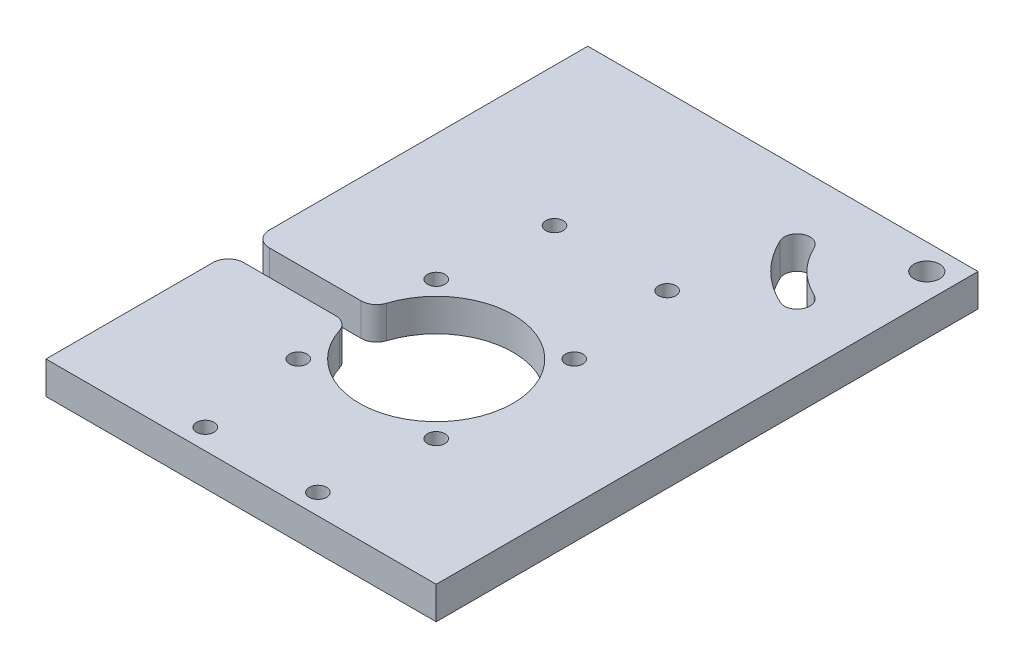
ISO-10303-21;
HEADER;
FILE_DESCRIPTION(('STEP AP214'),'2;1');
FILE_NAME('part.step','',(''),(''),'','','');
FILE_SCHEMA(('AUTOMOTIVE_DESIGN { 1 0 10303 214 1 1 1 1 }'));
ENDSEC;
DATA;
#1=APPLICATION_CONTEXT('core data for automotive mechanical design processes');
#2=APPLICATION_PROTOCOL_DEFINITION('international standard','automotive_design',2000,#1);
#3=PRODUCT_CONTEXT('',#1,'mechanical');
#4=PRODUCT('Part','Part','',(#3));
#5=PRODUCT_RELATED_PRODUCT_CATEGORY('part','',(#4));
#6=PRODUCT_DEFINITION_FORMATION('','',#4);
#7=PRODUCT_DEFINITION_CONTEXT('part definition',#1,'design');
#8=PRODUCT_DEFINITION('design','',#6,#7);
#9=PRODUCT_DEFINITION_SHAPE('','',#8);
#10=(LENGTH_UNIT() NAMED_UNIT(*) SI_UNIT(.MILLI.,.METRE.));
#11=(NAMED_UNIT(*) PLANE_ANGLE_UNIT() SI_UNIT($,.RADIAN.));
#12=(NAMED_UNIT(*) SI_UNIT($,.STERADIAN.) SOLID_ANGLE_UNIT());
#13=UNCERTAINTY_MEASURE_WITH_UNIT(LENGTH_MEASURE(1.E-05),#10,'distance_accuracy_value','');
#14=(GEOMETRIC_REPRESENTATION_CONTEXT(3) GLOBAL_UNCERTAINTY_ASSIGNED_CONTEXT((#13)) GLOBAL_UNIT_ASSIGNED_CONTEXT((#10,
#11,#12)) REPRESENTATION_CONTEXT('',''));
#15=CARTESIAN_POINT('',(0.,0.,0.));
#16=DIRECTION('',(0.,0.,1.));
#17=DIRECTION('',(1.,0.,0.));
#18=AXIS2_PLACEMENT_3D('',#15,#16,#17);
#19=CARTESIAN_POINT('',(0.,6.35,0.));
#20=DIRECTION('',(0.,-1.,0.));
#21=DIRECTION('',(0.,0.,-1.));
#22=AXIS2_PLACEMENT_3D('',#19,#20,#21);
#23=PLANE('',#22);
#24=CARTESIAN_POINT('',(-11.,6.35,34.1));
#25=DIRECTION('',(0.,1.,0.));
#26=DIRECTION('',(0.,0.,1.));
#27=AXIS2_PLACEMENT_3D('',#24,#25,#26);
#28=CIRCLE('',#27,1.69999999999999);
#29=CARTESIAN_POINT('',(-11.,6.35,35.8));
#30=VERTEX_POINT('',#29);
#31=EDGE_CURVE('E667',#30,#30,#28,.T.);
#32=ORIENTED_EDGE('',*,*,#31,.F.);
#33=EDGE_LOOP('',(#32));
#34=FACE_BOUND('',#33,.T.);
#35=CARTESIAN_POINT('',(11.,6.35,34.1));
#36=DIRECTION('',(0.,1.,0.));
#37=DIRECTION('',(0.,0.,1.));
#38=AXIS2_PLACEMENT_3D('',#35,#36,#37);
#39=CIRCLE('',#38,1.69999999999999);
#40=CARTESIAN_POINT('',(11.,6.35,35.8));
#41=VERTEX_POINT('',#40);
#42=EDGE_CURVE('E661',#41,#41,#39,.T.);
#43=ORIENTED_EDGE('',*,*,#42,.F.);
#44=EDGE_LOOP('',(#43));
#45=FACE_BOUND('',#44,.T.);
#46=CARTESIAN_POINT('',(-11.,6.35,-34.1));
#47=DIRECTION('',(0.,1.,0.));
#48=DIRECTION('',(0.,0.,1.));
#49=AXIS2_PLACEMENT_3D('',#46,#47,#48);
#50=CIRCLE('',#49,1.69999999999999);
#51=CARTESIAN_POINT('',(-11.,6.35,-32.4));
#52=VERTEX_POINT('',#51);
#53=EDGE_CURVE('E655',#52,#52,#50,.T.);
#54=ORIENTED_EDGE('',*,*,#53,.F.);
#55=EDGE_LOOP('',(#54));
#56=FACE_BOUND('',#55,.T.);
#57=CARTESIAN_POINT('',(11.,6.35,-34.1));
#58=DIRECTION('',(0.,1.,0.));
#59=DIRECTION('',(0.,0.,1.));
#60=AXIS2_PLACEMENT_3D('',#57,#58,#59);
#61=CIRCLE('',#60,1.69999999999999);
#62=CARTESIAN_POINT('',(11.,6.35,-32.4));
#63=VERTEX_POINT('',#62);
#64=EDGE_CURVE('E649',#63,#63,#61,.T.);
#65=ORIENTED_EDGE('',*,*,#64,.F.);
#66=EDGE_LOOP('',(#65));
#67=FACE_BOUND('',#66,.T.);
#68=CARTESIAN_POINT('',(-13.4703841816038,6.35,-13.4703841816037));
#69=DIRECTION('',(0.,1.,0.));
#70=DIRECTION('',(0.,0.,1.));
#71=AXIS2_PLACEMENT_3D('',#68,#69,#70);
#72=CIRCLE('',#71,1.69999999999999);
#73=CARTESIAN_POINT('',(-13.4703841816038,6.35,-11.7703841816037));
#74=VERTEX_POINT('',#73);
#75=EDGE_CURVE('E622',#74,#74,#72,.T.);
#76=ORIENTED_EDGE('',*,*,#75,.F.);
#77=EDGE_LOOP('',(#76));
#78=FACE_BOUND('',#77,.T.);
#79=CARTESIAN_POINT('',(13.4703841816037,6.35,-13.4703841816038));
#80=DIRECTION('',(0.,1.,0.));
#81=DIRECTION('',(0.,0.,1.));
#82=AXIS2_PLACEMENT_3D('',#79,#80,#81);
#83=CIRCLE('',#82,1.69999999999999);
#84=CARTESIAN_POINT('',(13.4703841816037,6.35,-11.7703841816038));
#85=VERTEX_POINT('',#84);
#86=EDGE_CURVE('E632',#85,#85,#83,.T.);
#87=ORIENTED_EDGE('',*,*,#86,.F.);
#88=EDGE_LOOP('',(#87));
#89=FACE_BOUND('',#88,.T.);
#90=DIRECTION('',(-1.,0.,0.));
#91=VECTOR('',#90,1.);
#92=CARTESIAN_POINT('',(-14.790199457749,6.35,2.5));
#93=LINE('',#92,#91);
#94=CARTESIAN_POINT('',(-17.1391365010026,6.35,2.5));
#95=VERTEX_POINT('',#94);
#96=CARTESIAN_POINT('',(-35.1,6.35,2.5));
#97=VERTEX_POINT('',#96);
#98=EDGE_CURVE('E331',#95,#97,#93,.T.);
#99=ORIENTED_EDGE('',*,*,#98,.T.);
#100=CARTESIAN_POINT('',(-35.1,6.35,5.5));
#101=DIRECTION('',(0.,-1.,0.));
#102=DIRECTION('',(0.,0.,-1.));
#103=AXIS2_PLACEMENT_3D('',#100,#101,#102);
#104=CIRCLE('',#103,3.);
#105=CARTESIAN_POINT('',(-38.1,6.35,5.5));
#106=VERTEX_POINT('',#105);
#107=EDGE_CURVE('E299',#97,#106,#104,.F.);
#108=ORIENTED_EDGE('',*,*,#107,.T.);
#109=DIRECTION('',(0.,0.,1.));
#110=VECTOR('',#109,1.);
#111=CARTESIAN_POINT('',(-38.1,6.35,2.5));
#112=LINE('',#111,#110);
#113=CARTESIAN_POINT('',(-38.1,6.35,38.1));
#114=VERTEX_POINT('',#113);
#115=EDGE_CURVE('E333',#106,#114,#112,.T.);
#116=ORIENTED_EDGE('',*,*,#115,.T.);
#117=DIRECTION('',(1.,0.,0.));
#118=VECTOR('',#117,1.);
#119=CARTESIAN_POINT('',(-38.1,6.35,38.1));
#120=LINE('',#119,#118);
#121=CARTESIAN_POINT('',(38.1,6.35,38.1));
#122=VERTEX_POINT('',#121);
#123=EDGE_CURVE('E237',#114,#122,#120,.T.);
#124=ORIENTED_EDGE('',*,*,#123,.T.);
#125=DIRECTION('',(0.,0.,-1.));
#126=VECTOR('',#125,1.);
#127=CARTESIAN_POINT('',(38.1,6.35,-67.7));
#128=LINE('',#127,#126);
#129=CARTESIAN_POINT('',(38.1,6.35,-67.7));
#130=VERTEX_POINT('',#129);
#131=EDGE_CURVE('E233',#122,#130,#128,.T.);
#132=ORIENTED_EDGE('',*,*,#131,.T.);
#133=DIRECTION('',(-1.,0.,0.));
#134=VECTOR('',#133,1.);
#135=CARTESIAN_POINT('',(-38.1,6.35,-67.7));
#136=LINE('',#135,#134);
#137=CARTESIAN_POINT('',(-38.1,6.35,-67.7));
#138=VERTEX_POINT('',#137);
#139=EDGE_CURVE('E236',#130,#138,#136,.T.);
#140=ORIENTED_EDGE('',*,*,#139,.T.);
#141=DIRECTION('',(0.,0.,1.));
#142=VECTOR('',#141,1.);
#143=CARTESIAN_POINT('',(-38.1,6.35,-67.7));
#144=LINE('',#143,#142);
#145=CARTESIAN_POINT('',(-38.1,6.35,-5.50000000000001));
#146=VERTEX_POINT('',#145);
#147=EDGE_CURVE('E241',#138,#146,#144,.T.);
#148=ORIENTED_EDGE('',*,*,#147,.T.);
#149=CARTESIAN_POINT('',(-35.1,6.35,-5.5));
#150=DIRECTION('',(0.,-1.,0.));
#151=DIRECTION('',(0.,0.,-1.));
#152=AXIS2_PLACEMENT_3D('',#149,#150,#151);
#153=CIRCLE('',#152,3.);
#154=CARTESIAN_POINT('',(-35.1,6.35,-2.5));
#155=VERTEX_POINT('',#154);
#156=EDGE_CURVE('E63',#146,#155,#153,.F.);
#157=ORIENTED_EDGE('',*,*,#156,.T.);
#158=DIRECTION('',(1.,0.,0.));
#159=VECTOR('',#158,1.);
#160=CARTESIAN_POINT('',(-38.1,6.35,-2.5));
#161=LINE('',#160,#159);
#162=CARTESIAN_POINT('',(-17.1391365010026,6.35,-2.5));
#163=VERTEX_POINT('',#162);
#164=EDGE_CURVE('E243',#155,#163,#161,.T.);
#165=ORIENTED_EDGE('',*,*,#164,.T.);
#166=CARTESIAN_POINT('',(-17.1391365010026,6.35,-5.5));
#167=DIRECTION('',(0.,-1.,0.));
#168=DIRECTION('',(0.,0.,-1.));
#169=AXIS2_PLACEMENT_3D('',#166,#167,#168);
#170=CIRCLE('',#169,3.);
#171=CARTESIAN_POINT('',(-14.2826137508355,6.35,-4.58333333333333));
#172=VERTEX_POINT('',#171);
#173=EDGE_CURVE('E294',#163,#172,#170,.F.);
#174=ORIENTED_EDGE('',*,*,#173,.T.);
#175=CARTESIAN_POINT('',(0.,6.35,0.));
#176=DIRECTION('',(0.,-1.,0.));
#177=DIRECTION('',(0.,0.,-1.));
#178=AXIS2_PLACEMENT_3D('',#175,#176,#177);
#179=CIRCLE('',#178,15.);
#180=CARTESIAN_POINT('',(-14.2826137508355,6.35,4.58333333333333));
#181=VERTEX_POINT('',#180);
#182=EDGE_CURVE('E266',#172,#181,#179,.T.);
#183=ORIENTED_EDGE('',*,*,#182,.T.);
#184=CARTESIAN_POINT('',(-17.1391365010026,6.35,5.5));
#185=DIRECTION('',(0.,-1.,0.));
#186=DIRECTION('',(0.,0.,-1.));
#187=AXIS2_PLACEMENT_3D('',#184,#185,#186);
#188=CIRCLE('',#187,3.);
#189=EDGE_CURVE('E296',#181,#95,#188,.F.);
#190=ORIENTED_EDGE('',*,*,#189,.T.);
#191=EDGE_LOOP('',(#99,#108,#116,#124,#132,#140,#148,#157,#165,#174,#183,#190));
#192=FACE_BOUND('',#191,.T.);
#193=CARTESIAN_POINT('',(25.0491221138397,6.35,-45.4348366569518));
#194=DIRECTION('',(0.,1.,0.));
#195=DIRECTION('',(0.,0.,1.));
#196=AXIS2_PLACEMENT_3D('',#193,#194,#195);
#197=CIRCLE('',#196,2.5);
#198=CARTESIAN_POINT('',(23.992576459488,6.35,-43.1690671893602));
#199=VERTEX_POINT('',#198);
#200=CARTESIAN_POINT('',(26.1056677681915,6.35,-47.7006061245434));
#201=VERTEX_POINT('',#200);
#202=EDGE_CURVE('E161',#199,#201,#197,.T.);
#203=ORIENTED_EDGE('',*,*,#202,.F.);
#204=CARTESIAN_POINT('',(33.1,6.35,-62.7));
#205=DIRECTION('',(0.,1.,0.));
#206=DIRECTION('',(0.,0.,-1.));
#207=AXIS2_PLACEMENT_3D('',#204,#205,#206);
#208=CIRCLE('',#207,21.55);
#209=CARTESIAN_POINT('',(13.5690671893602,6.35,-53.5925764594879));
#210=VERTEX_POINT('',#209);
#211=EDGE_CURVE('E191',#210,#199,#208,.T.);
#212=ORIENTED_EDGE('',*,*,#211,.F.);
#213=CARTESIAN_POINT('',(15.8348366569518,6.35,-54.6491221138396));
#214=DIRECTION('',(0.,1.,0.));
#215=DIRECTION('',(0.,0.,1.));
#216=AXIS2_PLACEMENT_3D('',#213,#214,#215);
#217=CIRCLE('',#216,2.5);
#218=CARTESIAN_POINT('',(18.1006061245434,6.35,-55.7056677681914));
#219=VERTEX_POINT('',#218);
#220=EDGE_CURVE('E187',#219,#210,#217,.T.);
#221=ORIENTED_EDGE('',*,*,#220,.F.);
#222=CARTESIAN_POINT('',(33.1,6.35,-62.7));
#223=DIRECTION('',(0.,-1.,0.));
#224=DIRECTION('',(0.,0.,-1.));
#225=AXIS2_PLACEMENT_3D('',#222,#223,#224);
#226=CIRCLE('',#225,16.55);
#227=EDGE_CURVE('E172',#201,#219,#226,.T.);
#228=ORIENTED_EDGE('',*,*,#227,.F.);
#229=EDGE_LOOP('',(#203,#212,#221,#228));
#230=FACE_BOUND('',#229,.T.);
#231=CARTESIAN_POINT('',(33.1,6.35,-62.7));
#232=DIRECTION('',(0.,1.,0.));
#233=DIRECTION('',(0.,0.,1.));
#234=AXIS2_PLACEMENT_3D('',#231,#232,#233);
#235=CIRCLE('',#234,2.5);
#236=CARTESIAN_POINT('',(33.1,6.35,-60.2));
#237=VERTEX_POINT('',#236);
#238=EDGE_CURVE('E201',#237,#237,#235,.T.);
#239=ORIENTED_EDGE('',*,*,#238,.F.);
#240=EDGE_LOOP('',(#239));
#241=FACE_BOUND('',#240,.T.);
#242=CARTESIAN_POINT('',(-13.4703841816037,6.35,13.4703841816038));
#243=DIRECTION('',(0.,1.,0.));
#244=DIRECTION('',(0.,0.,1.));
#245=AXIS2_PLACEMENT_3D('',#242,#243,#244);
#246=CIRCLE('',#245,1.69999999999999);
#247=CARTESIAN_POINT('',(-13.4703841816037,6.35,15.1703841816037));
#248=VERTEX_POINT('',#247);
#249=EDGE_CURVE('E623',#248,#248,#246,.T.);
#250=ORIENTED_EDGE('',*,*,#249,.F.);
#251=EDGE_LOOP('',(#250));
#252=FACE_BOUND('',#251,.T.);
#253=CARTESIAN_POINT('',(13.4703841816039,6.35,13.4703841816036));
#254=DIRECTION('',(0.,1.,0.));
#255=DIRECTION('',(0.,0.,1.));
#256=AXIS2_PLACEMENT_3D('',#253,#254,#255);
#257=CIRCLE('',#256,1.69999999999999);
#258=CARTESIAN_POINT('',(13.4703841816039,6.35,15.1703841816036));
#259=VERTEX_POINT('',#258);
#260=EDGE_CURVE('E643',#259,#259,#257,.T.);
#261=ORIENTED_EDGE('',*,*,#260,.F.);
#262=EDGE_LOOP('',(#261));
#263=FACE_BOUND('',#262,.T.);
#264=ADVANCED_FACE('F41',(#34,#45,#56,#67,#78,#89,#192,#230,#241,#252,#263),#23,.F.);
#265=CARTESIAN_POINT('',(0.,0.,0.));
#266=DIRECTION('',(0.,-1.,0.));
#267=DIRECTION('',(0.,0.,-1.));
#268=AXIS2_PLACEMENT_3D('',#265,#266,#267);
#269=PLANE('',#268);
#270=CARTESIAN_POINT('',(-11.,0.,34.1));
#271=DIRECTION('',(0.,1.,0.));
#272=DIRECTION('',(0.,0.,1.));
#273=AXIS2_PLACEMENT_3D('',#270,#271,#272);
#274=CIRCLE('',#273,1.7);
#275=CARTESIAN_POINT('',(-11.,0.,35.8));
#276=VERTEX_POINT('',#275);
#277=EDGE_CURVE('E664',#276,#276,#274,.T.);
#278=ORIENTED_EDGE('',*,*,#277,.T.);
#279=EDGE_LOOP('',(#278));
#280=FACE_BOUND('',#279,.T.);
#281=CARTESIAN_POINT('',(11.,0.,34.1));
#282=DIRECTION('',(0.,1.,0.));
#283=DIRECTION('',(0.,0.,1.));
#284=AXIS2_PLACEMENT_3D('',#281,#282,#283);
#285=CIRCLE('',#284,1.7);
#286=CARTESIAN_POINT('',(11.,0.,35.8));
#287=VERTEX_POINT('',#286);
#288=EDGE_CURVE('E658',#287,#287,#285,.T.);
#289=ORIENTED_EDGE('',*,*,#288,.T.);
#290=EDGE_LOOP('',(#289));
#291=FACE_BOUND('',#290,.T.);
#292=CARTESIAN_POINT('',(-11.,0.,-34.1));
#293=DIRECTION('',(0.,1.,0.));
#294=DIRECTION('',(0.,0.,1.));
#295=AXIS2_PLACEMENT_3D('',#292,#293,#294);
#296=CIRCLE('',#295,1.7);
#297=CARTESIAN_POINT('',(-11.,0.,-32.4));
#298=VERTEX_POINT('',#297);
#299=EDGE_CURVE('E652',#298,#298,#296,.T.);
#300=ORIENTED_EDGE('',*,*,#299,.T.);
#301=EDGE_LOOP('',(#300));
#302=FACE_BOUND('',#301,.T.);
#303=CARTESIAN_POINT('',(11.,0.,-34.1));
#304=DIRECTION('',(0.,1.,0.));
#305=DIRECTION('',(0.,0.,1.));
#306=AXIS2_PLACEMENT_3D('',#303,#304,#305);
#307=CIRCLE('',#306,1.7);
#308=CARTESIAN_POINT('',(11.,0.,-32.4));
#309=VERTEX_POINT('',#308);
#310=EDGE_CURVE('E646',#309,#309,#307,.T.);
#311=ORIENTED_EDGE('',*,*,#310,.T.);
#312=EDGE_LOOP('',(#311));
#313=FACE_BOUND('',#312,.T.);
#314=CARTESIAN_POINT('',(13.4703841816039,0.,13.4703841816036));
#315=DIRECTION('',(0.,1.,0.));
#316=DIRECTION('',(0.,0.,1.));
#317=AXIS2_PLACEMENT_3D('',#314,#315,#316);
#318=CIRCLE('',#317,1.7);
#319=CARTESIAN_POINT('',(13.4703841816039,0.,15.1703841816036));
#320=VERTEX_POINT('',#319);
#321=EDGE_CURVE('E628',#320,#320,#318,.T.);
#322=ORIENTED_EDGE('',*,*,#321,.T.);
#323=EDGE_LOOP('',(#322));
#324=FACE_BOUND('',#323,.T.);
#325=CARTESIAN_POINT('',(33.1,0.,-62.7));
#326=DIRECTION('',(0.,1.,0.));
#327=DIRECTION('',(0.,0.,1.));
#328=AXIS2_PLACEMENT_3D('',#325,#326,#327);
#329=CIRCLE('',#328,2.5);
#330=CARTESIAN_POINT('',(33.1,0.,-60.2));
#331=VERTEX_POINT('',#330);
#332=EDGE_CURVE('E227',#331,#331,#329,.T.);
#333=ORIENTED_EDGE('',*,*,#332,.T.);
#334=EDGE_LOOP('',(#333));
#335=FACE_BOUND('',#334,.T.);
#336=DIRECTION('',(0.,0.,1.));
#337=VECTOR('',#336,1.);
#338=CARTESIAN_POINT('',(-38.1,0.,2.5));
#339=LINE('',#338,#337);
#340=CARTESIAN_POINT('',(-38.1,0.,5.5));
#341=VERTEX_POINT('',#340);
#342=CARTESIAN_POINT('',(-38.1,0.,38.1));
#343=VERTEX_POINT('',#342);
#344=EDGE_CURVE('E252',#341,#343,#339,.T.);
#345=ORIENTED_EDGE('',*,*,#344,.F.);
#346=CARTESIAN_POINT('',(-35.1,0.,5.5));
#347=DIRECTION('',(0.,-1.,0.));
#348=DIRECTION('',(0.,0.,-1.));
#349=AXIS2_PLACEMENT_3D('',#346,#347,#348);
#350=CIRCLE('',#349,3.);
#351=CARTESIAN_POINT('',(-35.1,0.,2.5));
#352=VERTEX_POINT('',#351);
#353=EDGE_CURVE('E287',#341,#352,#350,.T.);
#354=ORIENTED_EDGE('',*,*,#353,.T.);
#355=DIRECTION('',(-1.,0.,0.));
#356=VECTOR('',#355,1.);
#357=CARTESIAN_POINT('',(-14.790199457749,0.,2.5));
#358=LINE('',#357,#356);
#359=CARTESIAN_POINT('',(-17.1391365010026,0.,2.5));
#360=VERTEX_POINT('',#359);
#361=EDGE_CURVE('E249',#360,#352,#358,.T.);
#362=ORIENTED_EDGE('',*,*,#361,.F.);
#363=CARTESIAN_POINT('',(-17.1391365010026,0.,5.5));
#364=DIRECTION('',(0.,-1.,0.));
#365=DIRECTION('',(0.,0.,-1.));
#366=AXIS2_PLACEMENT_3D('',#363,#364,#365);
#367=CIRCLE('',#366,3.);
#368=CARTESIAN_POINT('',(-14.2826137508355,0.,4.58333333333333));
#369=VERTEX_POINT('',#368);
#370=EDGE_CURVE('E283',#360,#369,#367,.T.);
#371=ORIENTED_EDGE('',*,*,#370,.T.);
#372=CARTESIAN_POINT('',(0.,0.,0.));
#373=DIRECTION('',(0.,-1.,0.));
#374=DIRECTION('',(0.,0.,-1.));
#375=AXIS2_PLACEMENT_3D('',#372,#373,#374);
#376=CIRCLE('',#375,15.);
#377=CARTESIAN_POINT('',(-14.2826137508355,0.,-4.58333333333333));
#378=VERTEX_POINT('',#377);
#379=EDGE_CURVE('E181',#378,#369,#376,.T.);
#380=ORIENTED_EDGE('',*,*,#379,.F.);
#381=CARTESIAN_POINT('',(-17.1391365010026,0.,-5.5));
#382=DIRECTION('',(0.,-1.,0.));
#383=DIRECTION('',(0.,0.,-1.));
#384=AXIS2_PLACEMENT_3D('',#381,#382,#383);
#385=CIRCLE('',#384,3.);
#386=CARTESIAN_POINT('',(-17.1391365010026,0.,-2.5));
#387=VERTEX_POINT('',#386);
#388=EDGE_CURVE('E281',#378,#387,#385,.T.);
#389=ORIENTED_EDGE('',*,*,#388,.T.);
#390=DIRECTION('',(1.,0.,0.));
#391=VECTOR('',#390,1.);
#392=CARTESIAN_POINT('',(-38.1,0.,-2.5));
#393=LINE('',#392,#391);
#394=CARTESIAN_POINT('',(-35.1,0.,-2.5));
#395=VERTEX_POINT('',#394);
#396=EDGE_CURVE('E263',#395,#387,#393,.T.);
#397=ORIENTED_EDGE('',*,*,#396,.F.);
#398=CARTESIAN_POINT('',(-35.1,0.,-5.5));
#399=DIRECTION('',(0.,-1.,0.));
#400=DIRECTION('',(0.,0.,-1.));
#401=AXIS2_PLACEMENT_3D('',#398,#399,#400);
#402=CIRCLE('',#401,3.);
#403=CARTESIAN_POINT('',(-38.1,0.,-5.50000000000001));
#404=VERTEX_POINT('',#403);
#405=EDGE_CURVE('E285',#395,#404,#402,.T.);
#406=ORIENTED_EDGE('',*,*,#405,.T.);
#407=DIRECTION('',(0.,0.,1.));
#408=VECTOR('',#407,1.);
#409=CARTESIAN_POINT('',(-38.1,0.,-67.7));
#410=LINE('',#409,#408);
#411=CARTESIAN_POINT('',(-38.1,0.,-67.7));
#412=VERTEX_POINT('',#411);
#413=EDGE_CURVE('E260',#412,#404,#410,.T.);
#414=ORIENTED_EDGE('',*,*,#413,.F.);
#415=DIRECTION('',(-1.,0.,0.));
#416=VECTOR('',#415,1.);
#417=CARTESIAN_POINT('',(-38.1,0.,-67.7));
#418=LINE('',#417,#416);
#419=CARTESIAN_POINT('',(38.1,0.,-67.7));
#420=VERTEX_POINT('',#419);
#421=EDGE_CURVE('E258',#420,#412,#418,.T.);
#422=ORIENTED_EDGE('',*,*,#421,.F.);
#423=DIRECTION('',(0.,0.,-1.));
#424=VECTOR('',#423,1.);
#425=CARTESIAN_POINT('',(38.1,0.,-67.7));
#426=LINE('',#425,#424);
#427=CARTESIAN_POINT('',(38.1,0.,38.1));
#428=VERTEX_POINT('',#427);
#429=EDGE_CURVE('E256',#428,#420,#426,.T.);
#430=ORIENTED_EDGE('',*,*,#429,.F.);
#431=DIRECTION('',(1.,0.,0.));
#432=VECTOR('',#431,1.);
#433=CARTESIAN_POINT('',(-38.1,0.,38.1));
#434=LINE('',#433,#432);
#435=EDGE_CURVE('E254',#343,#428,#434,.T.);
#436=ORIENTED_EDGE('',*,*,#435,.F.);
#437=EDGE_LOOP('',(#345,#354,#362,#371,#380,#389,#397,#406,#414,#422,#430,#436));
#438=FACE_BOUND('',#437,.T.);
#439=CARTESIAN_POINT('',(33.1,0.,-62.7));
#440=DIRECTION('',(0.,1.,0.));
#441=DIRECTION('',(0.,0.,-1.));
#442=AXIS2_PLACEMENT_3D('',#439,#440,#441);
#443=CIRCLE('',#442,21.55);
#444=CARTESIAN_POINT('',(13.5690671893602,0.,-53.5925764594879));
#445=VERTEX_POINT('',#444);
#446=CARTESIAN_POINT('',(23.992576459488,0.,-43.1690671893602));
#447=VERTEX_POINT('',#446);
#448=EDGE_CURVE('E173',#445,#447,#443,.T.);
#449=ORIENTED_EDGE('',*,*,#448,.T.);
#450=CARTESIAN_POINT('',(25.0491221138397,0.,-45.4348366569518));
#451=DIRECTION('',(0.,1.,0.));
#452=DIRECTION('',(0.,0.,1.));
#453=AXIS2_PLACEMENT_3D('',#450,#451,#452);
#454=CIRCLE('',#453,2.5);
#455=CARTESIAN_POINT('',(26.1056677681915,0.,-47.7006061245434));
#456=VERTEX_POINT('',#455);
#457=EDGE_CURVE('E198',#447,#456,#454,.T.);
#458=ORIENTED_EDGE('',*,*,#457,.T.);
#459=CARTESIAN_POINT('',(33.1,0.,-62.7));
#460=DIRECTION('',(0.,-1.,0.));
#461=DIRECTION('',(0.,0.,-1.));
#462=AXIS2_PLACEMENT_3D('',#459,#460,#461);
#463=CIRCLE('',#462,16.55);
#464=CARTESIAN_POINT('',(18.1006061245434,0.,-55.7056677681914));
#465=VERTEX_POINT('',#464);
#466=EDGE_CURVE('E179',#456,#465,#463,.T.);
#467=ORIENTED_EDGE('',*,*,#466,.T.);
#468=CARTESIAN_POINT('',(15.8348366569518,0.,-54.6491221138396));
#469=DIRECTION('',(0.,1.,0.));
#470=DIRECTION('',(0.,0.,1.));
#471=AXIS2_PLACEMENT_3D('',#468,#469,#470);
#472=CIRCLE('',#471,2.5);
#473=EDGE_CURVE('E204',#465,#445,#472,.T.);
#474=ORIENTED_EDGE('',*,*,#473,.T.);
#475=EDGE_LOOP('',(#449,#458,#467,#474));
#476=FACE_BOUND('',#475,.T.);
#477=CARTESIAN_POINT('',(13.4703841816037,0.,-13.4703841816038));
#478=DIRECTION('',(0.,1.,0.));
#479=DIRECTION('',(0.,0.,1.));
#480=AXIS2_PLACEMENT_3D('',#477,#478,#479);
#481=CIRCLE('',#480,1.7);
#482=CARTESIAN_POINT('',(13.4703841816037,0.,-11.7703841816038));
#483=VERTEX_POINT('',#482);
#484=EDGE_CURVE('E228',#483,#483,#481,.T.);
#485=ORIENTED_EDGE('',*,*,#484,.T.);
#486=EDGE_LOOP('',(#485));
#487=FACE_BOUND('',#486,.T.);
#488=CARTESIAN_POINT('',(-13.4703841816038,0.,-13.4703841816037));
#489=DIRECTION('',(0.,1.,0.));
#490=DIRECTION('',(0.,0.,1.));
#491=AXIS2_PLACEMENT_3D('',#488,#489,#490);
#492=CIRCLE('',#491,1.7);
#493=CARTESIAN_POINT('',(-13.4703841816038,0.,-11.7703841816037));
#494=VERTEX_POINT('',#493);
#495=EDGE_CURVE('E618',#494,#494,#492,.T.);
#496=ORIENTED_EDGE('',*,*,#495,.T.);
#497=EDGE_LOOP('',(#496));
#498=FACE_BOUND('',#497,.T.);
#499=CARTESIAN_POINT('',(-13.4703841816037,0.,13.4703841816038));
#500=DIRECTION('',(0.,1.,0.));
#501=DIRECTION('',(0.,0.,1.));
#502=AXIS2_PLACEMENT_3D('',#499,#500,#501);
#503=CIRCLE('',#502,1.7);
#504=CARTESIAN_POINT('',(-13.4703841816037,0.,15.1703841816038));
#505=VERTEX_POINT('',#504);
#506=EDGE_CURVE('E621',#505,#505,#503,.T.);
#507=ORIENTED_EDGE('',*,*,#506,.T.);
#508=EDGE_LOOP('',(#507));
#509=FACE_BOUND('',#508,.T.);
#510=ADVANCED_FACE('F318',(#280,#291,#302,#313,#324,#335,#438,#476,#487,#498,#509),#269,.T.);
#511=CARTESIAN_POINT('',(0.,6.35,0.));
#512=DIRECTION('',(0.,-1.,0.));
#513=DIRECTION('',(0.,0.,-1.));
#514=AXIS2_PLACEMENT_3D('',#511,#512,#513);
#515=CYLINDRICAL_SURFACE('',#514,15.);
#516=ORIENTED_EDGE('',*,*,#379,.T.);
#517=DIRECTION('',(0.,-1.,0.));
#518=VECTOR('',#517,1.);
#519=CARTESIAN_POINT('',(-14.2826137508355,6.35,4.58333333333333));
#520=LINE('',#519,#518);
#521=EDGE_CURVE('E12',#369,#181,#520,.F.);
#522=ORIENTED_EDGE('',*,*,#521,.T.);
#523=ORIENTED_EDGE('',*,*,#182,.F.);
#524=DIRECTION('',(0.,-1.,0.));
#525=VECTOR('',#524,1.);
#526=CARTESIAN_POINT('',(-14.2826137508355,6.35,-4.58333333333333));
#527=LINE('',#526,#525);
#528=EDGE_CURVE('E49',#172,#378,#527,.T.);
#529=ORIENTED_EDGE('',*,*,#528,.T.);
#530=EDGE_LOOP('',(#516,#522,#523,#529));
#531=FACE_BOUND('',#530,.T.);
#532=ADVANCED_FACE('F311',(#531),#515,.F.);
#533=CARTESIAN_POINT('',(-14.790199457749,6.35,2.5));
#534=DIRECTION('',(0.,0.,1.));
#535=DIRECTION('',(1.,0.,0.));
#536=AXIS2_PLACEMENT_3D('',#533,#534,#535);
#537=PLANE('',#536);
#538=ORIENTED_EDGE('',*,*,#361,.T.);
#539=DIRECTION('',(0.,-1.,0.));
#540=VECTOR('',#539,1.);
#541=CARTESIAN_POINT('',(-35.1,6.35,2.5));
#542=LINE('',#541,#540);
#543=EDGE_CURVE('E292',#352,#97,#542,.F.);
#544=ORIENTED_EDGE('',*,*,#543,.T.);
#545=ORIENTED_EDGE('',*,*,#98,.F.);
#546=DIRECTION('',(0.,-1.,0.));
#547=VECTOR('',#546,1.);
#548=CARTESIAN_POINT('',(-17.1391365010026,6.35,2.5));
#549=LINE('',#548,#547);
#550=EDGE_CURVE('E289',#95,#360,#549,.T.);
#551=ORIENTED_EDGE('',*,*,#550,.T.);
#552=EDGE_LOOP('',(#538,#544,#545,#551));
#553=FACE_BOUND('',#552,.T.);
#554=ADVANCED_FACE('F328',(#553),#537,.F.);
#555=CARTESIAN_POINT('',(-38.1,6.35,2.5));
#556=DIRECTION('',(1.,0.,0.));
#557=DIRECTION('',(0.,0.,-1.));
#558=AXIS2_PLACEMENT_3D('',#555,#556,#557);
#559=PLANE('',#558);
#560=ORIENTED_EDGE('',*,*,#115,.F.);
#561=DIRECTION('',(0.,-1.,0.));
#562=VECTOR('',#561,1.);
#563=CARTESIAN_POINT('',(-38.1,6.35,5.5));
#564=LINE('',#563,#562);
#565=EDGE_CURVE('E278',#106,#341,#564,.T.);
#566=ORIENTED_EDGE('',*,*,#565,.T.);
#567=ORIENTED_EDGE('',*,*,#344,.T.);
#568=DIRECTION('',(0.,-1.,0.));
#569=VECTOR('',#568,1.);
#570=CARTESIAN_POINT('',(-38.1,6.35,38.1));
#571=LINE('',#570,#569);
#572=EDGE_CURVE('E275',#114,#343,#571,.T.);
#573=ORIENTED_EDGE('',*,*,#572,.F.);
#574=EDGE_LOOP('',(#560,#566,#567,#573));
#575=FACE_BOUND('',#574,.T.);
#576=ADVANCED_FACE('F371',(#575),#559,.F.);
#577=CARTESIAN_POINT('',(-38.1,6.35,38.1));
#578=DIRECTION('',(0.,0.,-1.));
#579=DIRECTION('',(-1.,0.,0.));
#580=AXIS2_PLACEMENT_3D('',#577,#578,#579);
#581=PLANE('',#580);
#582=ORIENTED_EDGE('',*,*,#435,.T.);
#583=DIRECTION('',(0.,-1.,0.));
#584=VECTOR('',#583,1.);
#585=CARTESIAN_POINT('',(38.1,6.35,38.1));
#586=LINE('',#585,#584);
#587=EDGE_CURVE('E272',#122,#428,#586,.T.);
#588=ORIENTED_EDGE('',*,*,#587,.F.);
#589=ORIENTED_EDGE('',*,*,#123,.F.);
#590=ORIENTED_EDGE('',*,*,#572,.T.);
#591=EDGE_LOOP('',(#582,#588,#589,#590));
#592=FACE_BOUND('',#591,.T.);
#593=ADVANCED_FACE('F367',(#592),#581,.F.);
#594=CARTESIAN_POINT('',(38.1,6.35,-67.7));
#595=DIRECTION('',(-1.,0.,0.));
#596=DIRECTION('',(0.,0.,1.));
#597=AXIS2_PLACEMENT_3D('',#594,#595,#596);
#598=PLANE('',#597);
#599=ORIENTED_EDGE('',*,*,#429,.T.);
#600=DIRECTION('',(0.,-1.,0.));
#601=VECTOR('',#600,1.);
#602=CARTESIAN_POINT('',(38.1,6.35,-67.7));
#603=LINE('',#602,#601);
#604=EDGE_CURVE('E269',#130,#420,#603,.T.);
#605=ORIENTED_EDGE('',*,*,#604,.F.);
#606=ORIENTED_EDGE('',*,*,#131,.F.);
#607=ORIENTED_EDGE('',*,*,#587,.T.);
#608=EDGE_LOOP('',(#599,#605,#606,#607));
#609=FACE_BOUND('',#608,.T.);
#610=ADVANCED_FACE('F363',(#609),#598,.F.);
#611=CARTESIAN_POINT('',(-38.1,6.35,-67.7));
#612=DIRECTION('',(0.,0.,1.));
#613=DIRECTION('',(1.,0.,0.));
#614=AXIS2_PLACEMENT_3D('',#611,#612,#613);
#615=PLANE('',#614);
#616=ORIENTED_EDGE('',*,*,#421,.T.);
#617=DIRECTION('',(0.,-1.,0.));
#618=VECTOR('',#617,1.);
#619=CARTESIAN_POINT('',(-38.1,6.35,-67.7));
#620=LINE('',#619,#618);
#621=EDGE_CURVE('E246',#138,#412,#620,.T.);
#622=ORIENTED_EDGE('',*,*,#621,.F.);
#623=ORIENTED_EDGE('',*,*,#139,.F.);
#624=ORIENTED_EDGE('',*,*,#604,.T.);
#625=EDGE_LOOP('',(#616,#622,#623,#624));
#626=FACE_BOUND('',#625,.T.);
#627=ADVANCED_FACE('F359',(#626),#615,.F.);
#628=CARTESIAN_POINT('',(-38.1,6.35,-67.7));
#629=DIRECTION('',(1.,0.,0.));
#630=DIRECTION('',(0.,0.,-1.));
#631=AXIS2_PLACEMENT_3D('',#628,#629,#630);
#632=PLANE('',#631);
#633=ORIENTED_EDGE('',*,*,#413,.T.);
#634=DIRECTION('',(0.,-1.,0.));
#635=VECTOR('',#634,1.);
#636=CARTESIAN_POINT('',(-38.1,6.35,-5.50000000000001));
#637=LINE('',#636,#635);
#638=EDGE_CURVE('E305',#404,#146,#637,.F.);
#639=ORIENTED_EDGE('',*,*,#638,.T.);
#640=ORIENTED_EDGE('',*,*,#147,.F.);
#641=ORIENTED_EDGE('',*,*,#621,.T.);
#642=EDGE_LOOP('',(#633,#639,#640,#641));
#643=FACE_BOUND('',#642,.T.);
#644=ADVANCED_FACE('F356',(#643),#632,.F.);
#645=CARTESIAN_POINT('',(-38.1,6.35,-2.5));
#646=DIRECTION('',(0.,0.,-1.));
#647=DIRECTION('',(-1.,0.,0.));
#648=AXIS2_PLACEMENT_3D('',#645,#646,#647);
#649=PLANE('',#648);
#650=ORIENTED_EDGE('',*,*,#164,.F.);
#651=DIRECTION('',(0.,-1.,0.));
#652=VECTOR('',#651,1.);
#653=CARTESIAN_POINT('',(-35.1,6.35,-2.5));
#654=LINE('',#653,#652);
#655=EDGE_CURVE('E302',#155,#395,#654,.T.);
#656=ORIENTED_EDGE('',*,*,#655,.T.);
#657=ORIENTED_EDGE('',*,*,#396,.T.);
#658=DIRECTION('',(0.,-1.,0.));
#659=VECTOR('',#658,1.);
#660=CARTESIAN_POINT('',(-17.1391365010026,6.35,-2.5));
#661=LINE('',#660,#659);
#662=EDGE_CURVE('E56',#387,#163,#661,.F.);
#663=ORIENTED_EDGE('',*,*,#662,.T.);
#664=EDGE_LOOP('',(#650,#656,#657,#663));
#665=FACE_BOUND('',#664,.T.);
#666=ADVANCED_FACE('F353',(#665),#649,.F.);
#667=CARTESIAN_POINT('',(25.0491221138397,6.35,-45.4348366569518));
#668=DIRECTION('',(0.,-1.,0.));
#669=DIRECTION('',(0.,0.,-1.));
#670=AXIS2_PLACEMENT_3D('',#667,#668,#669);
#671=CYLINDRICAL_SURFACE('',#670,2.5);
#672=ORIENTED_EDGE('',*,*,#457,.F.);
#673=DIRECTION('',(0.,-1.,0.));
#674=VECTOR('',#673,1.);
#675=CARTESIAN_POINT('',(23.992576459488,6.35,-43.1690671893602));
#676=LINE('',#675,#674);
#677=EDGE_CURVE('E167',#199,#447,#676,.T.);
#678=ORIENTED_EDGE('',*,*,#677,.F.);
#679=ORIENTED_EDGE('',*,*,#202,.T.);
#680=DIRECTION('',(0.,-1.,0.));
#681=VECTOR('',#680,1.);
#682=CARTESIAN_POINT('',(26.1056677681915,6.35,-47.7006061245434));
#683=LINE('',#682,#681);
#684=EDGE_CURVE('E164',#201,#456,#683,.T.);
#685=ORIENTED_EDGE('',*,*,#684,.T.);
#686=EDGE_LOOP('',(#672,#678,#679,#685));
#687=FACE_BOUND('',#686,.T.);
#688=ADVANCED_FACE('F163',(#687),#671,.F.);
#689=CARTESIAN_POINT('',(33.1,6.35,-62.7));
#690=DIRECTION('',(0.,-1.,0.));
#691=DIRECTION('',(0.,0.,-1.));
#692=AXIS2_PLACEMENT_3D('',#689,#690,#691);
#693=CYLINDRICAL_SURFACE('',#692,16.55);
#694=ORIENTED_EDGE('',*,*,#466,.F.);
#695=ORIENTED_EDGE('',*,*,#684,.F.);
#696=ORIENTED_EDGE('',*,*,#227,.T.);
#697=DIRECTION('',(0.,-1.,0.));
#698=VECTOR('',#697,1.);
#699=CARTESIAN_POINT('',(18.1006061245434,6.35,-55.7056677681914));
#700=LINE('',#699,#698);
#701=EDGE_CURVE('E182',#219,#465,#700,.T.);
#702=ORIENTED_EDGE('',*,*,#701,.T.);
#703=EDGE_LOOP('',(#694,#695,#696,#702));
#704=FACE_BOUND('',#703,.T.);
#705=ADVANCED_FACE('F176',(#704),#693,.T.);
#706=CARTESIAN_POINT('',(15.8348366569518,6.35,-54.6491221138396));
#707=DIRECTION('',(0.,-1.,0.));
#708=DIRECTION('',(0.,0.,-1.));
#709=AXIS2_PLACEMENT_3D('',#706,#707,#708);
#710=CYLINDRICAL_SURFACE('',#709,2.5);
#711=ORIENTED_EDGE('',*,*,#473,.F.);
#712=ORIENTED_EDGE('',*,*,#701,.F.);
#713=ORIENTED_EDGE('',*,*,#220,.T.);
#714=DIRECTION('',(0.,-1.,0.));
#715=VECTOR('',#714,1.);
#716=CARTESIAN_POINT('',(13.5690671893602,6.35,-53.5925764594879));
#717=LINE('',#716,#715);
#718=EDGE_CURVE('E212',#210,#445,#717,.T.);
#719=ORIENTED_EDGE('',*,*,#718,.T.);
#720=EDGE_LOOP('',(#711,#712,#713,#719));
#721=FACE_BOUND('',#720,.T.);
#722=ADVANCED_FACE('F525',(#721),#710,.F.);
#723=CARTESIAN_POINT('',(33.1,6.35,-62.7));
#724=DIRECTION('',(0.,-1.,0.));
#725=DIRECTION('',(0.,0.,-1.));
#726=AXIS2_PLACEMENT_3D('',#723,#724,#725);
#727=CYLINDRICAL_SURFACE('',#726,21.55);
#728=ORIENTED_EDGE('',*,*,#448,.F.);
#729=ORIENTED_EDGE('',*,*,#718,.F.);
#730=ORIENTED_EDGE('',*,*,#211,.T.);
#731=ORIENTED_EDGE('',*,*,#677,.T.);
#732=EDGE_LOOP('',(#728,#729,#730,#731));
#733=FACE_BOUND('',#732,.T.);
#734=ADVANCED_FACE('F516',(#733),#727,.F.);
#735=CARTESIAN_POINT('',(33.1,6.35,-62.7));
#736=DIRECTION('',(0.,-1.,0.));
#737=DIRECTION('',(0.,0.,-1.));
#738=AXIS2_PLACEMENT_3D('',#735,#736,#737);
#739=CYLINDRICAL_SURFACE('',#738,2.5);
#740=ORIENTED_EDGE('',*,*,#238,.T.);
#741=EDGE_LOOP('',(#740));
#742=FACE_BOUND('',#741,.T.);
#743=ORIENTED_EDGE('',*,*,#332,.F.);
#744=EDGE_LOOP('',(#743));
#745=FACE_BOUND('',#744,.T.);
#746=ADVANCED_FACE('F507',(#742,#745),#739,.F.);
#747=CARTESIAN_POINT('',(13.4703841816037,6.35,-13.4703841816038));
#748=DIRECTION('',(0.,1.,0.));
#749=DIRECTION('',(0.,0.,1.));
#750=AXIS2_PLACEMENT_3D('',#747,#748,#749);
#751=CYLINDRICAL_SURFACE('',#750,1.69999999999999);
#752=ORIENTED_EDGE('',*,*,#484,.F.);
#753=EDGE_LOOP('',(#752));
#754=FACE_BOUND('',#753,.T.);
#755=ORIENTED_EDGE('',*,*,#86,.T.);
#756=EDGE_LOOP('',(#755));
#757=FACE_BOUND('',#756,.T.);
#758=ADVANCED_FACE('F487',(#754,#757),#751,.F.);
#759=CARTESIAN_POINT('',(-13.4703841816038,6.35,-13.4703841816037));
#760=DIRECTION('',(0.,1.,0.));
#761=DIRECTION('',(0.,0.,1.));
#762=AXIS2_PLACEMENT_3D('',#759,#760,#761);
#763=CYLINDRICAL_SURFACE('',#762,1.69999999999999);
#764=ORIENTED_EDGE('',*,*,#495,.F.);
#765=EDGE_LOOP('',(#764));
#766=FACE_BOUND('',#765,.T.);
#767=ORIENTED_EDGE('',*,*,#75,.T.);
#768=EDGE_LOOP('',(#767));
#769=FACE_BOUND('',#768,.T.);
#770=ADVANCED_FACE('F478',(#766,#769),#763,.F.);
#771=CARTESIAN_POINT('',(-13.4703841816037,6.35,13.4703841816038));
#772=DIRECTION('',(0.,1.,0.));
#773=DIRECTION('',(0.,0.,1.));
#774=AXIS2_PLACEMENT_3D('',#771,#772,#773);
#775=CYLINDRICAL_SURFACE('',#774,1.69999999999999);
#776=ORIENTED_EDGE('',*,*,#506,.F.);
#777=EDGE_LOOP('',(#776));
#778=FACE_BOUND('',#777,.T.);
#779=ORIENTED_EDGE('',*,*,#249,.T.);
#780=EDGE_LOOP('',(#779));
#781=FACE_BOUND('',#780,.T.);
#782=ADVANCED_FACE('F469',(#778,#781),#775,.F.);
#783=CARTESIAN_POINT('',(13.4703841816039,6.35,13.4703841816036));
#784=DIRECTION('',(0.,1.,0.));
#785=DIRECTION('',(0.,0.,1.));
#786=AXIS2_PLACEMENT_3D('',#783,#784,#785);
#787=CYLINDRICAL_SURFACE('',#786,1.69999999999999);
#788=ORIENTED_EDGE('',*,*,#321,.F.);
#789=EDGE_LOOP('',(#788));
#790=FACE_BOUND('',#789,.T.);
#791=ORIENTED_EDGE('',*,*,#260,.T.);
#792=EDGE_LOOP('',(#791));
#793=FACE_BOUND('',#792,.T.);
#794=ADVANCED_FACE('F460',(#790,#793),#787,.F.);
#795=CARTESIAN_POINT('',(11.,6.35,-34.1));
#796=DIRECTION('',(0.,1.,0.));
#797=DIRECTION('',(0.,0.,1.));
#798=AXIS2_PLACEMENT_3D('',#795,#796,#797);
#799=CYLINDRICAL_SURFACE('',#798,1.69999999999999);
#800=ORIENTED_EDGE('',*,*,#310,.F.);
#801=EDGE_LOOP('',(#800));
#802=FACE_BOUND('',#801,.T.);
#803=ORIENTED_EDGE('',*,*,#64,.T.);
#804=EDGE_LOOP('',(#803));
#805=FACE_BOUND('',#804,.T.);
#806=ADVANCED_FACE('F451',(#802,#805),#799,.F.);
#807=CARTESIAN_POINT('',(-11.,6.35,-34.1));
#808=DIRECTION('',(0.,1.,0.));
#809=DIRECTION('',(0.,0.,1.));
#810=AXIS2_PLACEMENT_3D('',#807,#808,#809);
#811=CYLINDRICAL_SURFACE('',#810,1.69999999999999);
#812=ORIENTED_EDGE('',*,*,#299,.F.);
#813=EDGE_LOOP('',(#812));
#814=FACE_BOUND('',#813,.T.);
#815=ORIENTED_EDGE('',*,*,#53,.T.);
#816=EDGE_LOOP('',(#815));
#817=FACE_BOUND('',#816,.T.);
#818=ADVANCED_FACE('F442',(#814,#817),#811,.F.);
#819=CARTESIAN_POINT('',(11.,6.35,34.1));
#820=DIRECTION('',(0.,1.,0.));
#821=DIRECTION('',(0.,0.,1.));
#822=AXIS2_PLACEMENT_3D('',#819,#820,#821);
#823=CYLINDRICAL_SURFACE('',#822,1.69999999999999);
#824=ORIENTED_EDGE('',*,*,#288,.F.);
#825=EDGE_LOOP('',(#824));
#826=FACE_BOUND('',#825,.T.);
#827=ORIENTED_EDGE('',*,*,#42,.T.);
#828=EDGE_LOOP('',(#827));
#829=FACE_BOUND('',#828,.T.);
#830=ADVANCED_FACE('F432',(#826,#829),#823,.F.);
#831=CARTESIAN_POINT('',(-11.,6.35,34.1));
#832=DIRECTION('',(0.,1.,0.));
#833=DIRECTION('',(0.,0.,1.));
#834=AXIS2_PLACEMENT_3D('',#831,#832,#833);
#835=CYLINDRICAL_SURFACE('',#834,1.69999999999999);
#836=ORIENTED_EDGE('',*,*,#277,.F.);
#837=EDGE_LOOP('',(#836));
#838=FACE_BOUND('',#837,.T.);
#839=ORIENTED_EDGE('',*,*,#31,.T.);
#840=EDGE_LOOP('',(#839));
#841=FACE_BOUND('',#840,.T.);
#842=ADVANCED_FACE('F383',(#838,#841),#835,.F.);
#843=CARTESIAN_POINT('',(-35.1,6.35,5.5));
#844=DIRECTION('',(0.,-1.,0.));
#845=DIRECTION('',(0.,0.,-1.));
#846=AXIS2_PLACEMENT_3D('',#843,#844,#845);
#847=CYLINDRICAL_SURFACE('',#846,3.);
#848=ORIENTED_EDGE('',*,*,#107,.F.);
#849=ORIENTED_EDGE('',*,*,#543,.F.);
#850=ORIENTED_EDGE('',*,*,#353,.F.);
#851=ORIENTED_EDGE('',*,*,#565,.F.);
#852=EDGE_LOOP('',(#848,#849,#850,#851));
#853=FACE_BOUND('',#852,.T.);
#854=ADVANCED_FACE('F380',(#853),#847,.T.);
#855=CARTESIAN_POINT('',(-35.1,6.35,-5.5));
#856=DIRECTION('',(0.,-1.,0.));
#857=DIRECTION('',(0.,0.,-1.));
#858=AXIS2_PLACEMENT_3D('',#855,#856,#857);
#859=CYLINDRICAL_SURFACE('',#858,3.);
#860=ORIENTED_EDGE('',*,*,#156,.F.);
#861=ORIENTED_EDGE('',*,*,#638,.F.);
#862=ORIENTED_EDGE('',*,*,#405,.F.);
#863=ORIENTED_EDGE('',*,*,#655,.F.);
#864=EDGE_LOOP('',(#860,#861,#862,#863));
#865=FACE_BOUND('',#864,.T.);
#866=ADVANCED_FACE('F339',(#865),#859,.T.);
#867=CARTESIAN_POINT('',(-17.1391365010026,6.35,5.5));
#868=DIRECTION('',(0.,-1.,0.));
#869=DIRECTION('',(0.,0.,-1.));
#870=AXIS2_PLACEMENT_3D('',#867,#868,#869);
#871=CYLINDRICAL_SURFACE('',#870,3.);
#872=ORIENTED_EDGE('',*,*,#189,.F.);
#873=ORIENTED_EDGE('',*,*,#521,.F.);
#874=ORIENTED_EDGE('',*,*,#370,.F.);
#875=ORIENTED_EDGE('',*,*,#550,.F.);
#876=EDGE_LOOP('',(#872,#873,#874,#875));
#877=FACE_BOUND('',#876,.T.);
#878=ADVANCED_FACE('F325',(#877),#871,.T.);
#879=CARTESIAN_POINT('',(-17.1391365010026,6.35,-5.5));
#880=DIRECTION('',(0.,-1.,0.));
#881=DIRECTION('',(0.,0.,-1.));
#882=AXIS2_PLACEMENT_3D('',#879,#880,#881);
#883=CYLINDRICAL_SURFACE('',#882,3.);
#884=ORIENTED_EDGE('',*,*,#173,.F.);
#885=ORIENTED_EDGE('',*,*,#662,.F.);
#886=ORIENTED_EDGE('',*,*,#388,.F.);
#887=ORIENTED_EDGE('',*,*,#528,.F.);
#888=EDGE_LOOP('',(#884,#885,#886,#887));
#889=FACE_BOUND('',#888,.T.);
#890=ADVANCED_FACE('F43',(#889),#883,.T.);
#891=CLOSED_SHELL('',(#264,#510,#532,#554,#576,#593,#610,#627,#644,#666,#688,#705,#722,#734,
#746,#758,#770,#782,#794,#806,#818,#830,#842,#854,#866,#878,#890));
#892=MANIFOLD_SOLID_BREP('B2',#891);
#893=ADVANCED_BREP_SHAPE_REPRESENTATION('',(#18,#892),#14);
#894=SHAPE_DEFINITION_REPRESENTATION(#9,#893);
ENDSEC;
END-ISO-10303-21;
